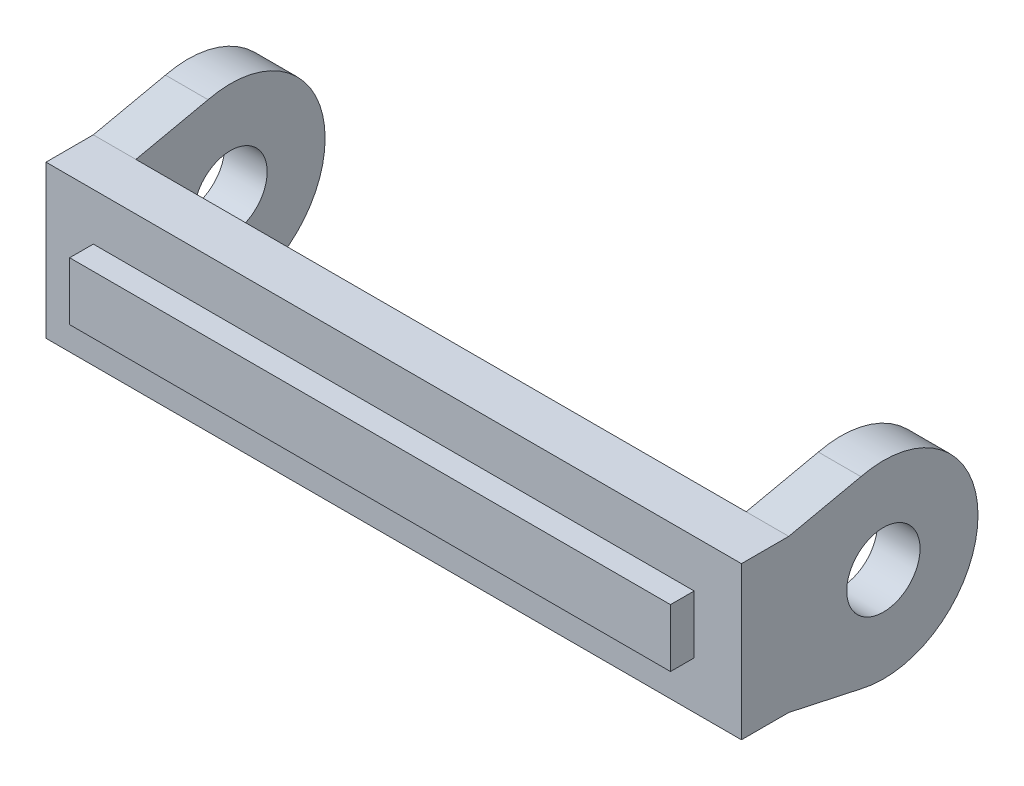
ISO-10303-21;
HEADER;
FILE_DESCRIPTION(('STEP AP214'),'2;1');
FILE_NAME('part.step','',(''),(''),'','','');
FILE_SCHEMA(('AUTOMOTIVE_DESIGN { 1 0 10303 214 1 1 1 1 }'));
ENDSEC;
DATA;
#1=APPLICATION_CONTEXT('core data for automotive mechanical design processes');
#2=APPLICATION_PROTOCOL_DEFINITION('international standard','automotive_design',2000,#1);
#3=PRODUCT_CONTEXT('',#1,'mechanical');
#4=PRODUCT('Part','Part','',(#3));
#5=PRODUCT_RELATED_PRODUCT_CATEGORY('part','',(#4));
#6=PRODUCT_DEFINITION_FORMATION('','',#4);
#7=PRODUCT_DEFINITION_CONTEXT('part definition',#1,'design');
#8=PRODUCT_DEFINITION('design','',#6,#7);
#9=PRODUCT_DEFINITION_SHAPE('','',#8);
#10=(LENGTH_UNIT() NAMED_UNIT(*) SI_UNIT(.MILLI.,.METRE.));
#11=(NAMED_UNIT(*) PLANE_ANGLE_UNIT() SI_UNIT($,.RADIAN.));
#12=(NAMED_UNIT(*) SI_UNIT($,.STERADIAN.) SOLID_ANGLE_UNIT());
#13=UNCERTAINTY_MEASURE_WITH_UNIT(LENGTH_MEASURE(1.E-05),#10,'distance_accuracy_value','');
#14=(GEOMETRIC_REPRESENTATION_CONTEXT(3) GLOBAL_UNCERTAINTY_ASSIGNED_CONTEXT((#13)) GLOBAL_UNIT_ASSIGNED_CONTEXT((#10,
#11,#12)) REPRESENTATION_CONTEXT('',''));
#15=CARTESIAN_POINT('',(0.,0.,0.));
#16=DIRECTION('',(0.,0.,1.));
#17=DIRECTION('',(1.,0.,0.));
#18=AXIS2_PLACEMENT_3D('',#15,#16,#17);
#19=CARTESIAN_POINT('',(-48.7807822818189,13.6321196404152,-3.55055625977731));
#20=DIRECTION('',(0.,-0.977340888738785,0.211671413278415));
#21=DIRECTION('',(0.,-0.211671413278415,-0.977340888738785));
#22=AXIS2_PLACEMENT_3D('',#19,#20,#21);
#23=PLANE('',#22);
#24=DIRECTION('',(1.,0.,0.));
#25=VECTOR('',#24,1.);
#26=CARTESIAN_POINT('',(-48.7807822818189,13.6321196404152,-3.55055625977731));
#27=LINE('',#26,#25);
#28=CARTESIAN_POINT('',(-37.4670737828342,13.6321196404152,-3.55055625977731));
#29=VERTEX_POINT('',#28);
#30=CARTESIAN_POINT('',(-35.6670737828342,13.6321196404152,-3.55055625977731));
#31=VERTEX_POINT('',#30);
#32=EDGE_CURVE('E262',#29,#31,#27,.T.);
#33=ORIENTED_EDGE('',*,*,#32,.T.);
#34=DIRECTION('',(0.,0.211671413278415,0.977340888738785));
#35=VECTOR('',#34,1.);
#36=CARTESIAN_POINT('',(-35.6670737828342,13.6321196404152,-3.55055625977731));
#37=LINE('',#36,#35);
#38=CARTESIAN_POINT('',(-35.6670737828342,14.2928057553957,-0.5));
#39=VERTEX_POINT('',#38);
#40=EDGE_CURVE('E164',#31,#39,#37,.T.);
#41=ORIENTED_EDGE('',*,*,#40,.T.);
#42=DIRECTION('',(-1.,0.,0.));
#43=VECTOR('',#42,1.);
#44=CARTESIAN_POINT('',(-8.06707378283418,14.2928057553957,-0.5));
#45=LINE('',#44,#43);
#46=CARTESIAN_POINT('',(-37.4670737828342,14.2928057553957,-0.5));
#47=VERTEX_POINT('',#46);
#48=EDGE_CURVE('E162',#39,#47,#45,.T.);
#49=ORIENTED_EDGE('',*,*,#48,.T.);
#50=DIRECTION('',(0.,0.211671413278415,0.977340888738785));
#51=VECTOR('',#50,1.);
#52=CARTESIAN_POINT('',(-37.4670737828342,13.6321196404152,-3.55055625977731));
#53=LINE('',#52,#51);
#54=EDGE_CURVE('E242',#29,#47,#53,.T.);
#55=ORIENTED_EDGE('',*,*,#54,.F.);
#56=EDGE_LOOP('',(#33,#41,#49,#55));
#57=FACE_BOUND('',#56,.T.);
#58=ADVANCED_FACE('F33',(#57),#23,.T.);
#59=CARTESIAN_POINT('',(-8.06707378283418,14.2928057553957,-0.5));
#60=VERTEX_POINT('',#59);
#61=CARTESIAN_POINT('',(-9.86707378283418,14.2928057553957,-0.499999999999999));
#62=VERTEX_POINT('',#61);
#63=EDGE_CURVE('E159',#60,#62,#45,.T.);
#64=ORIENTED_EDGE('',*,*,#63,.T.);
#65=DIRECTION('',(0.,-0.211671413278415,-0.977340888738785));
#66=VECTOR('',#65,1.);
#67=CARTESIAN_POINT('',(-9.86707378283418,13.6321196404152,-3.55055625977731));
#68=LINE('',#67,#66);
#69=CARTESIAN_POINT('',(-9.86707378283418,13.6321196404152,-3.55055625977731));
#70=VERTEX_POINT('',#69);
#71=EDGE_CURVE('E135',#62,#70,#68,.T.);
#72=ORIENTED_EDGE('',*,*,#71,.T.);
#73=CARTESIAN_POINT('',(-8.06707378283418,13.6321196404152,-3.55055625977731));
#74=VERTEX_POINT('',#73);
#75=EDGE_CURVE('E259',#70,#74,#27,.T.);
#76=ORIENTED_EDGE('',*,*,#75,.T.);
#77=DIRECTION('',(0.,-0.211671413278415,-0.977340888738785));
#78=VECTOR('',#77,1.);
#79=CARTESIAN_POINT('',(-8.06707378283418,13.6321196404152,-3.55055625977731));
#80=LINE('',#79,#78);
#81=EDGE_CURVE('E169',#60,#74,#80,.T.);
#82=ORIENTED_EDGE('',*,*,#81,.F.);
#83=EDGE_LOOP('',(#64,#72,#76,#82));
#84=FACE_BOUND('',#83,.T.);
#85=ADVANCED_FACE('F167',(#84),#23,.T.);
#86=CARTESIAN_POINT('',(-48.7807822818189,17.5178057553957,-4.5));
#87=DIRECTION('',(1.,0.,0.));
#88=DIRECTION('',(0.,0.,-1.));
#89=AXIS2_PLACEMENT_3D('',#86,#87,#88);
#90=CYLINDRICAL_SURFACE('',#89,4.);
#91=DIRECTION('',(1.,0.,0.));
#92=VECTOR('',#91,1.);
#93=CARTESIAN_POINT('',(-48.7807822818189,21.4034918703762,-3.55055625977731));
#94=LINE('',#93,#92);
#95=CARTESIAN_POINT('',(-37.4670737828342,21.4034918703762,-3.55055625977731));
#96=VERTEX_POINT('',#95);
#97=CARTESIAN_POINT('',(-35.6670737828342,21.4034918703762,-3.55055625977731));
#98=VERTEX_POINT('',#97);
#99=EDGE_CURVE('E248',#96,#98,#94,.T.);
#100=ORIENTED_EDGE('',*,*,#99,.T.);
#101=CARTESIAN_POINT('',(-35.6670737828342,17.5178057553957,-4.5));
#102=DIRECTION('',(1.,0.,0.));
#103=DIRECTION('',(0.,0.,-1.));
#104=AXIS2_PLACEMENT_3D('',#101,#102,#103);
#105=CIRCLE('',#104,4.);
#106=EDGE_CURVE('E238',#98,#31,#105,.F.);
#107=ORIENTED_EDGE('',*,*,#106,.T.);
#108=ORIENTED_EDGE('',*,*,#32,.F.);
#109=CARTESIAN_POINT('',(-37.4670737828342,17.5178057553957,-4.5));
#110=DIRECTION('',(1.,0.,0.));
#111=DIRECTION('',(0.,0.,-1.));
#112=AXIS2_PLACEMENT_3D('',#109,#110,#111);
#113=CIRCLE('',#112,4.);
#114=EDGE_CURVE('E246',#96,#29,#113,.F.);
#115=ORIENTED_EDGE('',*,*,#114,.F.);
#116=EDGE_LOOP('',(#100,#107,#108,#115));
#117=FACE_BOUND('',#116,.T.);
#118=ADVANCED_FACE('F296',(#117),#90,.T.);
#119=ORIENTED_EDGE('',*,*,#75,.F.);
#120=CARTESIAN_POINT('',(-9.86707378283418,17.5178057553957,-4.5));
#121=DIRECTION('',(-1.,0.,0.));
#122=DIRECTION('',(0.,0.,1.));
#123=AXIS2_PLACEMENT_3D('',#120,#121,#122);
#124=CIRCLE('',#123,4.);
#125=CARTESIAN_POINT('',(-9.86707378283418,21.4034918703762,-3.55055625977731));
#126=VERTEX_POINT('',#125);
#127=EDGE_CURVE('E139',#70,#126,#124,.F.);
#128=ORIENTED_EDGE('',*,*,#127,.T.);
#129=CARTESIAN_POINT('',(-8.06707378283418,21.4034918703762,-3.55055625977731));
#130=VERTEX_POINT('',#129);
#131=EDGE_CURVE('E261',#126,#130,#94,.T.);
#132=ORIENTED_EDGE('',*,*,#131,.T.);
#133=CARTESIAN_POINT('',(-8.06707378283418,17.5178057553957,-4.5));
#134=DIRECTION('',(1.,0.,0.));
#135=DIRECTION('',(0.,0.,-1.));
#136=AXIS2_PLACEMENT_3D('',#133,#134,#135);
#137=CIRCLE('',#136,4.);
#138=EDGE_CURVE('E253',#74,#130,#137,.T.);
#139=ORIENTED_EDGE('',*,*,#138,.F.);
#140=EDGE_LOOP('',(#119,#128,#132,#139));
#141=FACE_BOUND('',#140,.T.);
#142=ADVANCED_FACE('F269',(#141),#90,.T.);
#143=CARTESIAN_POINT('',(-48.7807822818189,20.7428057553957,-0.5));
#144=DIRECTION('',(0.,0.977340888738785,0.211671413278415));
#145=DIRECTION('',(0.,-0.211671413278415,0.977340888738785));
#146=AXIS2_PLACEMENT_3D('',#143,#144,#145);
#147=PLANE('',#146);
#148=DIRECTION('',(1.,0.,0.));
#149=VECTOR('',#148,1.);
#150=CARTESIAN_POINT('',(-8.06707378283418,20.7428057553957,-0.5));
#151=LINE('',#150,#149);
#152=CARTESIAN_POINT('',(-37.4670737828342,20.7428057553957,-0.5));
#153=VERTEX_POINT('',#152);
#154=CARTESIAN_POINT('',(-35.6670737828342,20.7428057553957,-0.5));
#155=VERTEX_POINT('',#154);
#156=EDGE_CURVE('E173',#153,#155,#151,.T.);
#157=ORIENTED_EDGE('',*,*,#156,.T.);
#158=DIRECTION('',(0.,0.211671413278415,-0.977340888738785));
#159=VECTOR('',#158,1.);
#160=CARTESIAN_POINT('',(-35.6670737828342,20.7428057553957,-0.5));
#161=LINE('',#160,#159);
#162=EDGE_CURVE('E235',#155,#98,#161,.T.);
#163=ORIENTED_EDGE('',*,*,#162,.T.);
#164=ORIENTED_EDGE('',*,*,#99,.F.);
#165=DIRECTION('',(0.,0.211671413278415,-0.977340888738785));
#166=VECTOR('',#165,1.);
#167=CARTESIAN_POINT('',(-37.4670737828342,20.7428057553957,-0.5));
#168=LINE('',#167,#166);
#169=EDGE_CURVE('E245',#153,#96,#168,.T.);
#170=ORIENTED_EDGE('',*,*,#169,.F.);
#171=EDGE_LOOP('',(#157,#163,#164,#170));
#172=FACE_BOUND('',#171,.T.);
#173=ADVANCED_FACE('F292',(#172),#147,.T.);
#174=ORIENTED_EDGE('',*,*,#131,.F.);
#175=DIRECTION('',(0.,-0.211671413278415,0.977340888738785));
#176=VECTOR('',#175,1.);
#177=CARTESIAN_POINT('',(-9.86707378283418,20.7428057553957,-0.499999999999994));
#178=LINE('',#177,#176);
#179=CARTESIAN_POINT('',(-9.86707378283418,20.7428057553957,-0.5));
#180=VERTEX_POINT('',#179);
#181=EDGE_CURVE('E227',#126,#180,#178,.T.);
#182=ORIENTED_EDGE('',*,*,#181,.T.);
#183=CARTESIAN_POINT('',(-8.06707378283418,20.7428057553957,-0.5));
#184=VERTEX_POINT('',#183);
#185=EDGE_CURVE('E170',#180,#184,#151,.T.);
#186=ORIENTED_EDGE('',*,*,#185,.T.);
#187=DIRECTION('',(0.,-0.211671413278415,0.977340888738785));
#188=VECTOR('',#187,1.);
#189=CARTESIAN_POINT('',(-8.06707378283418,20.7428057553957,-0.5));
#190=LINE('',#189,#188);
#191=EDGE_CURVE('E256',#130,#184,#190,.T.);
#192=ORIENTED_EDGE('',*,*,#191,.F.);
#193=EDGE_LOOP('',(#174,#182,#186,#192));
#194=FACE_BOUND('',#193,.T.);
#195=ADVANCED_FACE('F289',(#194),#147,.T.);
#196=CARTESIAN_POINT('',(-48.7807822818189,17.5178057553957,-4.5));
#197=DIRECTION('',(1.,0.,0.));
#198=DIRECTION('',(0.,0.,-1.));
#199=AXIS2_PLACEMENT_3D('',#196,#197,#198);
#200=CYLINDRICAL_SURFACE('',#199,1.55);
#201=CARTESIAN_POINT('',(-37.4670737828342,17.5178057553957,-4.5));
#202=DIRECTION('',(1.,0.,0.));
#203=DIRECTION('',(0.,0.,-1.));
#204=AXIS2_PLACEMENT_3D('',#201,#202,#203);
#205=CIRCLE('',#204,1.55);
#206=CARTESIAN_POINT('',(-37.4670737828342,17.5178057553957,-6.05));
#207=VERTEX_POINT('',#206);
#208=EDGE_CURVE('E176',#207,#207,#205,.F.);
#209=ORIENTED_EDGE('',*,*,#208,.T.);
#210=EDGE_LOOP('',(#209));
#211=FACE_BOUND('',#210,.T.);
#212=CARTESIAN_POINT('',(-35.6670737828342,17.5178057553957,-4.5));
#213=DIRECTION('',(1.,0.,0.));
#214=DIRECTION('',(0.,0.,-1.));
#215=AXIS2_PLACEMENT_3D('',#212,#213,#214);
#216=CIRCLE('',#215,1.55);
#217=CARTESIAN_POINT('',(-35.6670737828342,17.5178057553957,-6.05));
#218=VERTEX_POINT('',#217);
#219=EDGE_CURVE('E37',#218,#218,#216,.F.);
#220=ORIENTED_EDGE('',*,*,#219,.F.);
#221=EDGE_LOOP('',(#220));
#222=FACE_BOUND('',#221,.T.);
#223=ADVANCED_FACE('F304',(#211,#222),#200,.F.);
#224=CARTESIAN_POINT('',(-8.06707378283418,17.5178057553957,-4.5));
#225=DIRECTION('',(1.,0.,0.));
#226=DIRECTION('',(0.,0.,-1.));
#227=AXIS2_PLACEMENT_3D('',#224,#225,#226);
#228=CIRCLE('',#227,1.55);
#229=CARTESIAN_POINT('',(-8.06707378283418,17.5178057553957,-6.05));
#230=VERTEX_POINT('',#229);
#231=EDGE_CURVE('E163',#230,#230,#228,.T.);
#232=ORIENTED_EDGE('',*,*,#231,.T.);
#233=EDGE_LOOP('',(#232));
#234=FACE_BOUND('',#233,.T.);
#235=CARTESIAN_POINT('',(-9.86707378283418,17.5178057553957,-4.5));
#236=DIRECTION('',(-1.,0.,0.));
#237=DIRECTION('',(0.,0.,1.));
#238=AXIS2_PLACEMENT_3D('',#235,#236,#237);
#239=CIRCLE('',#238,1.55);
#240=CARTESIAN_POINT('',(-9.86707378283418,17.5178057553957,-2.95));
#241=VERTEX_POINT('',#240);
#242=EDGE_CURVE('E225',#241,#241,#239,.F.);
#243=ORIENTED_EDGE('',*,*,#242,.F.);
#244=EDGE_LOOP('',(#243));
#245=FACE_BOUND('',#244,.T.);
#246=ADVANCED_FACE('F306',(#234,#245),#200,.F.);
#247=CARTESIAN_POINT('',(-35.4670737828342,18.7428057553957,2.5));
#248=DIRECTION('',(1.,0.,0.));
#249=DIRECTION('',(0.,0.,-1.));
#250=AXIS2_PLACEMENT_3D('',#247,#248,#249);
#251=PLANE('',#250);
#252=DIRECTION('',(0.,-1.,0.));
#253=VECTOR('',#252,1.);
#254=CARTESIAN_POINT('',(-35.4670737828342,18.7428057553957,1.5));
#255=LINE('',#254,#253);
#256=CARTESIAN_POINT('',(-35.4670737828342,18.7428057553957,1.5));
#257=VERTEX_POINT('',#256);
#258=CARTESIAN_POINT('',(-35.4670737828342,16.2928057553957,1.5));
#259=VERTEX_POINT('',#258);
#260=EDGE_CURVE('E199',#257,#259,#255,.T.);
#261=ORIENTED_EDGE('',*,*,#260,.T.);
#262=DIRECTION('',(0.,0.,-1.));
#263=VECTOR('',#262,1.);
#264=CARTESIAN_POINT('',(-35.4670737828342,16.2928057553957,2.5));
#265=LINE('',#264,#263);
#266=CARTESIAN_POINT('',(-35.4670737828342,16.2928057553957,2.5));
#267=VERTEX_POINT('',#266);
#268=EDGE_CURVE('E11',#267,#259,#265,.T.);
#269=ORIENTED_EDGE('',*,*,#268,.F.);
#270=DIRECTION('',(0.,-1.,0.));
#271=VECTOR('',#270,1.);
#272=CARTESIAN_POINT('',(-35.4670737828342,18.7428057553957,2.5));
#273=LINE('',#272,#271);
#274=CARTESIAN_POINT('',(-35.4670737828342,18.7428057553957,2.5));
#275=VERTEX_POINT('',#274);
#276=EDGE_CURVE('E200',#275,#267,#273,.T.);
#277=ORIENTED_EDGE('',*,*,#276,.F.);
#278=DIRECTION('',(0.,0.,-1.));
#279=VECTOR('',#278,1.);
#280=CARTESIAN_POINT('',(-35.4670737828342,18.7428057553957,2.5));
#281=LINE('',#280,#279);
#282=EDGE_CURVE('E208',#275,#257,#281,.T.);
#283=ORIENTED_EDGE('',*,*,#282,.T.);
#284=EDGE_LOOP('',(#261,#269,#277,#283));
#285=FACE_BOUND('',#284,.T.);
#286=ADVANCED_FACE('F35',(#285),#251,.F.);
#287=CARTESIAN_POINT('',(-35.4670737828342,16.2928057553957,2.5));
#288=DIRECTION('',(0.,1.,0.));
#289=DIRECTION('',(0.,0.,1.));
#290=AXIS2_PLACEMENT_3D('',#287,#288,#289);
#291=PLANE('',#290);
#292=DIRECTION('',(1.,0.,0.));
#293=VECTOR('',#292,1.);
#294=CARTESIAN_POINT('',(-35.4670737828342,16.2928057553957,1.5));
#295=LINE('',#294,#293);
#296=CARTESIAN_POINT('',(-10.0670737828342,16.2928057553957,1.5));
#297=VERTEX_POINT('',#296);
#298=EDGE_CURVE('E211',#259,#297,#295,.T.);
#299=ORIENTED_EDGE('',*,*,#298,.T.);
#300=DIRECTION('',(0.,0.,-1.));
#301=VECTOR('',#300,1.);
#302=CARTESIAN_POINT('',(-10.0670737828342,16.2928057553957,2.5));
#303=LINE('',#302,#301);
#304=CARTESIAN_POINT('',(-10.0670737828342,16.2928057553957,2.5));
#305=VERTEX_POINT('',#304);
#306=EDGE_CURVE('E42',#305,#297,#303,.T.);
#307=ORIENTED_EDGE('',*,*,#306,.F.);
#308=DIRECTION('',(1.,0.,0.));
#309=VECTOR('',#308,1.);
#310=CARTESIAN_POINT('',(-35.4670737828342,16.2928057553957,2.5));
#311=LINE('',#310,#309);
#312=EDGE_CURVE('E202',#267,#305,#311,.T.);
#313=ORIENTED_EDGE('',*,*,#312,.F.);
#314=ORIENTED_EDGE('',*,*,#268,.T.);
#315=EDGE_LOOP('',(#299,#307,#313,#314));
#316=FACE_BOUND('',#315,.T.);
#317=ADVANCED_FACE('F343',(#316),#291,.F.);
#318=CARTESIAN_POINT('',(-10.0670737828342,18.7428057553957,2.5));
#319=DIRECTION('',(-1.,0.,0.));
#320=DIRECTION('',(0.,0.,1.));
#321=AXIS2_PLACEMENT_3D('',#318,#319,#320);
#322=PLANE('',#321);
#323=DIRECTION('',(0.,1.,0.));
#324=VECTOR('',#323,1.);
#325=CARTESIAN_POINT('',(-10.0670737828342,18.7428057553957,1.5));
#326=LINE('',#325,#324);
#327=CARTESIAN_POINT('',(-10.0670737828342,18.7428057553957,1.5));
#328=VERTEX_POINT('',#327);
#329=EDGE_CURVE('E214',#297,#328,#326,.T.);
#330=ORIENTED_EDGE('',*,*,#329,.T.);
#331=DIRECTION('',(0.,0.,-1.));
#332=VECTOR('',#331,1.);
#333=CARTESIAN_POINT('',(-10.0670737828342,18.7428057553957,2.5));
#334=LINE('',#333,#332);
#335=CARTESIAN_POINT('',(-10.0670737828342,18.7428057553957,2.5));
#336=VERTEX_POINT('',#335);
#337=EDGE_CURVE('E221',#336,#328,#334,.T.);
#338=ORIENTED_EDGE('',*,*,#337,.F.);
#339=DIRECTION('',(0.,1.,0.));
#340=VECTOR('',#339,1.);
#341=CARTESIAN_POINT('',(-10.0670737828342,18.7428057553957,2.5));
#342=LINE('',#341,#340);
#343=EDGE_CURVE('E205',#305,#336,#342,.T.);
#344=ORIENTED_EDGE('',*,*,#343,.F.);
#345=ORIENTED_EDGE('',*,*,#306,.T.);
#346=EDGE_LOOP('',(#330,#338,#344,#345));
#347=FACE_BOUND('',#346,.T.);
#348=ADVANCED_FACE('F340',(#347),#322,.F.);
#349=CARTESIAN_POINT('',(-35.4670737828342,18.7428057553957,2.5));
#350=DIRECTION('',(0.,-1.,0.));
#351=DIRECTION('',(0.,0.,-1.));
#352=AXIS2_PLACEMENT_3D('',#349,#350,#351);
#353=PLANE('',#352);
#354=DIRECTION('',(-1.,0.,0.));
#355=VECTOR('',#354,1.);
#356=CARTESIAN_POINT('',(-35.4670737828342,18.7428057553957,1.5));
#357=LINE('',#356,#355);
#358=EDGE_CURVE('E203',#328,#257,#357,.T.);
#359=ORIENTED_EDGE('',*,*,#358,.T.);
#360=ORIENTED_EDGE('',*,*,#282,.F.);
#361=DIRECTION('',(-1.,0.,0.));
#362=VECTOR('',#361,1.);
#363=CARTESIAN_POINT('',(-35.4670737828342,18.7428057553957,2.5));
#364=LINE('',#363,#362);
#365=EDGE_CURVE('E58',#336,#275,#364,.T.);
#366=ORIENTED_EDGE('',*,*,#365,.F.);
#367=ORIENTED_EDGE('',*,*,#337,.T.);
#368=EDGE_LOOP('',(#359,#360,#366,#367));
#369=FACE_BOUND('',#368,.T.);
#370=ADVANCED_FACE('F337',(#369),#353,.F.);
#371=CARTESIAN_POINT('',(0.,0.,2.5));
#372=DIRECTION('',(0.,0.,1.));
#373=DIRECTION('',(1.,0.,0.));
#374=AXIS2_PLACEMENT_3D('',#371,#372,#373);
#375=PLANE('',#374);
#376=ORIENTED_EDGE('',*,*,#276,.T.);
#377=ORIENTED_EDGE('',*,*,#312,.T.);
#378=ORIENTED_EDGE('',*,*,#343,.T.);
#379=ORIENTED_EDGE('',*,*,#365,.T.);
#380=EDGE_LOOP('',(#376,#377,#378,#379));
#381=FACE_BOUND('',#380,.T.);
#382=ADVANCED_FACE('F334',(#381),#375,.T.);
#383=CARTESIAN_POINT('',(-8.06707378283418,20.7428057553957,-0.5));
#384=DIRECTION('',(-1.,0.,0.));
#385=DIRECTION('',(0.,0.,1.));
#386=AXIS2_PLACEMENT_3D('',#383,#384,#385);
#387=PLANE('',#386);
#388=DIRECTION('',(0.,-1.,0.));
#389=VECTOR('',#388,1.);
#390=CARTESIAN_POINT('',(-8.06707378283418,20.7428057553957,1.5));
#391=LINE('',#390,#389);
#392=CARTESIAN_POINT('',(-8.06707378283418,20.7428057553957,1.5));
#393=VERTEX_POINT('',#392);
#394=CARTESIAN_POINT('',(-8.06707378283418,14.2928057553957,1.5));
#395=VERTEX_POINT('',#394);
#396=EDGE_CURVE('E181',#393,#395,#391,.T.);
#397=ORIENTED_EDGE('',*,*,#396,.T.);
#398=DIRECTION('',(0.,0.,1.));
#399=VECTOR('',#398,1.);
#400=CARTESIAN_POINT('',(-8.06707378283418,14.2928057553957,-0.5));
#401=LINE('',#400,#399);
#402=EDGE_CURVE('E197',#60,#395,#401,.T.);
#403=ORIENTED_EDGE('',*,*,#402,.F.);
#404=ORIENTED_EDGE('',*,*,#81,.T.);
#405=ORIENTED_EDGE('',*,*,#138,.T.);
#406=ORIENTED_EDGE('',*,*,#191,.T.);
#407=DIRECTION('',(0.,0.,1.));
#408=VECTOR('',#407,1.);
#409=CARTESIAN_POINT('',(-8.06707378283418,20.7428057553957,-0.5));
#410=LINE('',#409,#408);
#411=EDGE_CURVE('E180',#184,#393,#410,.T.);
#412=ORIENTED_EDGE('',*,*,#411,.T.);
#413=EDGE_LOOP('',(#397,#403,#404,#405,#406,#412));
#414=FACE_BOUND('',#413,.T.);
#415=ORIENTED_EDGE('',*,*,#231,.F.);
#416=EDGE_LOOP('',(#415));
#417=FACE_BOUND('',#416,.T.);
#418=ADVANCED_FACE('F273',(#414,#417),#387,.F.);
#419=CARTESIAN_POINT('',(-8.06707378283418,14.2928057553957,-0.5));
#420=DIRECTION('',(0.,1.,0.));
#421=DIRECTION('',(0.,0.,1.));
#422=AXIS2_PLACEMENT_3D('',#419,#420,#421);
#423=PLANE('',#422);
#424=DIRECTION('',(-1.,0.,0.));
#425=VECTOR('',#424,1.);
#426=CARTESIAN_POINT('',(-8.06707378283418,14.2928057553957,1.5));
#427=LINE('',#426,#425);
#428=CARTESIAN_POINT('',(-37.4670737828342,14.2928057553957,1.5));
#429=VERTEX_POINT('',#428);
#430=EDGE_CURVE('E184',#395,#429,#427,.T.);
#431=ORIENTED_EDGE('',*,*,#430,.T.);
#432=DIRECTION('',(0.,0.,1.));
#433=VECTOR('',#432,1.);
#434=CARTESIAN_POINT('',(-37.4670737828342,14.2928057553957,-0.5));
#435=LINE('',#434,#433);
#436=EDGE_CURVE('E194',#47,#429,#435,.T.);
#437=ORIENTED_EDGE('',*,*,#436,.F.);
#438=ORIENTED_EDGE('',*,*,#48,.F.);
#439=DIRECTION('',(1.,0.,0.));
#440=VECTOR('',#439,1.);
#441=CARTESIAN_POINT('',(-48.7807822818189,14.2928057553957,-0.5));
#442=LINE('',#441,#440);
#443=EDGE_CURVE('E148',#39,#62,#442,.T.);
#444=ORIENTED_EDGE('',*,*,#443,.T.);
#445=ORIENTED_EDGE('',*,*,#63,.F.);
#446=ORIENTED_EDGE('',*,*,#402,.T.);
#447=EDGE_LOOP('',(#431,#437,#438,#444,#445,#446));
#448=FACE_BOUND('',#447,.T.);
#449=ADVANCED_FACE('F157',(#448),#423,.F.);
#450=CARTESIAN_POINT('',(-37.4670737828342,20.7428057553957,-0.5));
#451=DIRECTION('',(1.,0.,0.));
#452=DIRECTION('',(0.,0.,-1.));
#453=AXIS2_PLACEMENT_3D('',#450,#451,#452);
#454=PLANE('',#453);
#455=DIRECTION('',(0.,1.,0.));
#456=VECTOR('',#455,1.);
#457=CARTESIAN_POINT('',(-37.4670737828342,20.7428057553957,1.5));
#458=LINE('',#457,#456);
#459=CARTESIAN_POINT('',(-37.4670737828342,20.7428057553957,1.5));
#460=VERTEX_POINT('',#459);
#461=EDGE_CURVE('E186',#429,#460,#458,.T.);
#462=ORIENTED_EDGE('',*,*,#461,.T.);
#463=DIRECTION('',(0.,0.,1.));
#464=VECTOR('',#463,1.);
#465=CARTESIAN_POINT('',(-37.4670737828342,20.7428057553957,-0.5));
#466=LINE('',#465,#464);
#467=EDGE_CURVE('E191',#153,#460,#466,.T.);
#468=ORIENTED_EDGE('',*,*,#467,.F.);
#469=ORIENTED_EDGE('',*,*,#169,.T.);
#470=ORIENTED_EDGE('',*,*,#114,.T.);
#471=ORIENTED_EDGE('',*,*,#54,.T.);
#472=ORIENTED_EDGE('',*,*,#436,.T.);
#473=EDGE_LOOP('',(#462,#468,#469,#470,#471,#472));
#474=FACE_BOUND('',#473,.T.);
#475=ORIENTED_EDGE('',*,*,#208,.F.);
#476=EDGE_LOOP('',(#475));
#477=FACE_BOUND('',#476,.T.);
#478=ADVANCED_FACE('F279',(#474,#477),#454,.F.);
#479=CARTESIAN_POINT('',(-8.06707378283418,20.7428057553957,-0.5));
#480=DIRECTION('',(0.,-1.,0.));
#481=DIRECTION('',(0.,0.,-1.));
#482=AXIS2_PLACEMENT_3D('',#479,#480,#481);
#483=PLANE('',#482);
#484=DIRECTION('',(1.,0.,0.));
#485=VECTOR('',#484,1.);
#486=CARTESIAN_POINT('',(-8.06707378283418,20.7428057553957,1.5));
#487=LINE('',#486,#485);
#488=EDGE_CURVE('E174',#460,#393,#487,.T.);
#489=ORIENTED_EDGE('',*,*,#488,.T.);
#490=ORIENTED_EDGE('',*,*,#411,.F.);
#491=ORIENTED_EDGE('',*,*,#185,.F.);
#492=EDGE_CURVE('E151',#155,#180,#151,.T.);
#493=ORIENTED_EDGE('',*,*,#492,.F.);
#494=ORIENTED_EDGE('',*,*,#156,.F.);
#495=ORIENTED_EDGE('',*,*,#467,.T.);
#496=EDGE_LOOP('',(#489,#490,#491,#493,#494,#495));
#497=FACE_BOUND('',#496,.T.);
#498=ADVANCED_FACE('F285',(#497),#483,.F.);
#499=CARTESIAN_POINT('',(0.,0.,1.5));
#500=DIRECTION('',(0.,0.,-1.));
#501=DIRECTION('',(-1.,0.,0.));
#502=AXIS2_PLACEMENT_3D('',#499,#500,#501);
#503=PLANE('',#502);
#504=ORIENTED_EDGE('',*,*,#260,.F.);
#505=ORIENTED_EDGE('',*,*,#358,.F.);
#506=ORIENTED_EDGE('',*,*,#329,.F.);
#507=ORIENTED_EDGE('',*,*,#298,.F.);
#508=EDGE_LOOP('',(#504,#505,#506,#507));
#509=FACE_BOUND('',#508,.T.);
#510=ORIENTED_EDGE('',*,*,#396,.F.);
#511=ORIENTED_EDGE('',*,*,#488,.F.);
#512=ORIENTED_EDGE('',*,*,#461,.F.);
#513=ORIENTED_EDGE('',*,*,#430,.F.);
#514=EDGE_LOOP('',(#510,#511,#512,#513));
#515=FACE_BOUND('',#514,.T.);
#516=ADVANCED_FACE('F282',(#509,#515),#503,.F.);
#517=CARTESIAN_POINT('',(-35.6670737828342,32.7428057553957,-0.5));
#518=DIRECTION('',(1.,0.,0.));
#519=DIRECTION('',(0.,0.,-1.));
#520=AXIS2_PLACEMENT_3D('',#517,#518,#519);
#521=PLANE('',#520);
#522=ORIENTED_EDGE('',*,*,#106,.F.);
#523=ORIENTED_EDGE('',*,*,#162,.F.);
#524=DIRECTION('',(0.,-1.,0.));
#525=VECTOR('',#524,1.);
#526=CARTESIAN_POINT('',(-35.6670737828342,32.7428057553957,-0.5));
#527=LINE('',#526,#525);
#528=EDGE_CURVE('E153',#155,#39,#527,.T.);
#529=ORIENTED_EDGE('',*,*,#528,.T.);
#530=ORIENTED_EDGE('',*,*,#40,.F.);
#531=EDGE_LOOP('',(#522,#523,#529,#530));
#532=FACE_BOUND('',#531,.T.);
#533=ORIENTED_EDGE('',*,*,#219,.T.);
#534=EDGE_LOOP('',(#533));
#535=FACE_BOUND('',#534,.T.);
#536=ADVANCED_FACE('F297',(#532,#535),#521,.T.);
#537=CARTESIAN_POINT('',(-9.86707378283418,32.7428057553957,-0.5));
#538=DIRECTION('',(-1.,0.,0.));
#539=DIRECTION('',(0.,0.,1.));
#540=AXIS2_PLACEMENT_3D('',#537,#538,#539);
#541=PLANE('',#540);
#542=DIRECTION('',(0.,-1.,0.));
#543=VECTOR('',#542,1.);
#544=CARTESIAN_POINT('',(-9.86707378283418,32.7428057553957,-0.5));
#545=LINE('',#544,#543);
#546=EDGE_CURVE('E50',#180,#62,#545,.T.);
#547=ORIENTED_EDGE('',*,*,#546,.F.);
#548=ORIENTED_EDGE('',*,*,#181,.F.);
#549=ORIENTED_EDGE('',*,*,#127,.F.);
#550=ORIENTED_EDGE('',*,*,#71,.F.);
#551=EDGE_LOOP('',(#547,#548,#549,#550));
#552=FACE_BOUND('',#551,.T.);
#553=ORIENTED_EDGE('',*,*,#242,.T.);
#554=EDGE_LOOP('',(#553));
#555=FACE_BOUND('',#554,.T.);
#556=ADVANCED_FACE('F136',(#552,#555),#541,.T.);
#557=CARTESIAN_POINT('',(-35.6670737828342,32.7428057553957,-0.5));
#558=DIRECTION('',(0.,0.,-1.));
#559=DIRECTION('',(-1.,0.,0.));
#560=AXIS2_PLACEMENT_3D('',#557,#558,#559);
#561=PLANE('',#560);
#562=ORIENTED_EDGE('',*,*,#528,.F.);
#563=ORIENTED_EDGE('',*,*,#492,.T.);
#564=ORIENTED_EDGE('',*,*,#546,.T.);
#565=ORIENTED_EDGE('',*,*,#443,.F.);
#566=EDGE_LOOP('',(#562,#563,#564,#565));
#567=FACE_BOUND('',#566,.T.);
#568=ADVANCED_FACE('F147',(#567),#561,.T.);
#569=CLOSED_SHELL('',(#58,#85,#118,#142,#173,#195,#223,#246,#286,#317,#348,#370,#382,#418,#449,
#478,#498,#516,#536,#556,#568));
#570=MANIFOLD_SOLID_BREP('B2',#569);
#571=ADVANCED_BREP_SHAPE_REPRESENTATION('',(#18,#570),#14);
#572=SHAPE_DEFINITION_REPRESENTATION(#9,#571);
ENDSEC;
END-ISO-10303-21;
